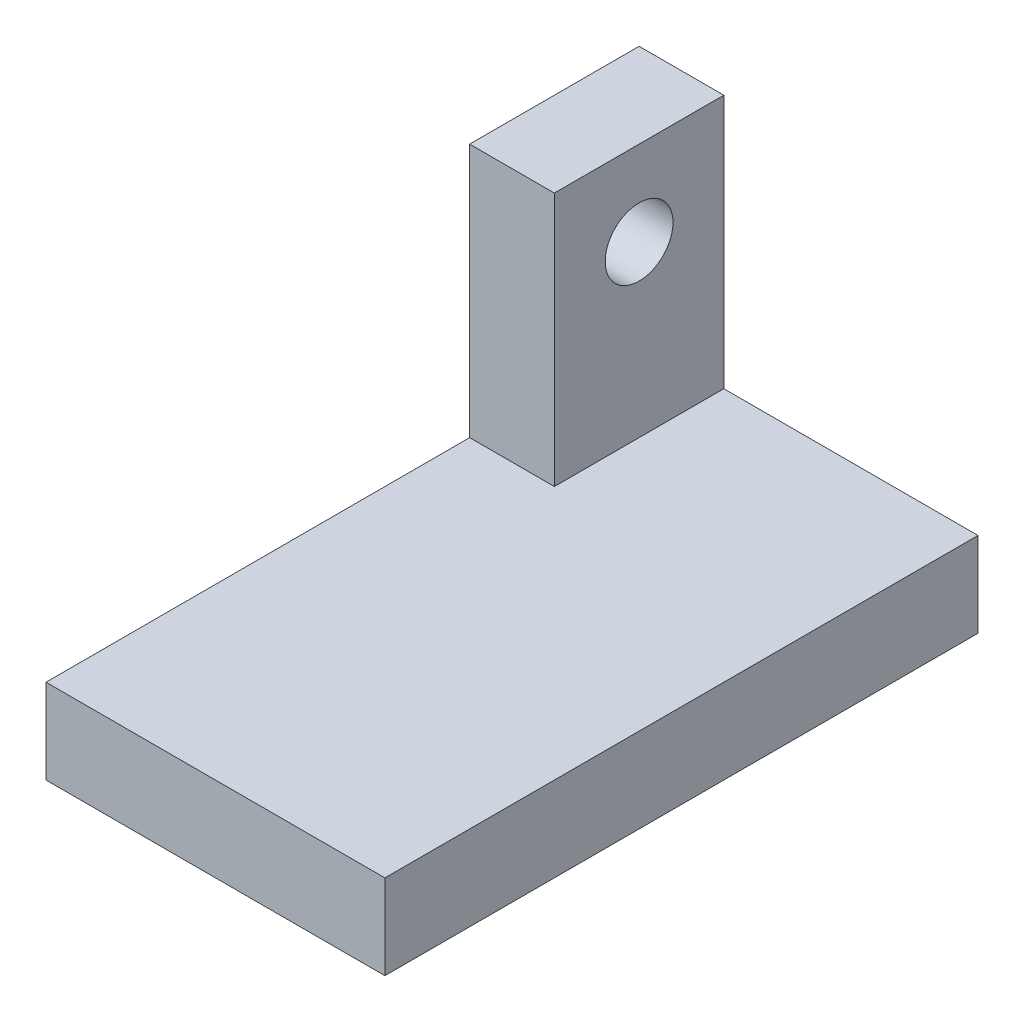
ISO-10303-21;
HEADER;
FILE_DESCRIPTION(('STEP AP214'),'2;1');
FILE_NAME('part.step','',(''),(''),'','','');
FILE_SCHEMA(('AUTOMOTIVE_DESIGN { 1 0 10303 214 1 1 1 1 }'));
ENDSEC;
DATA;
#1=APPLICATION_CONTEXT('core data for automotive mechanical design processes');
#2=APPLICATION_PROTOCOL_DEFINITION('international standard','automotive_design',2000,#1);
#3=PRODUCT_CONTEXT('',#1,'mechanical');
#4=PRODUCT('Part','Part','',(#3));
#5=PRODUCT_RELATED_PRODUCT_CATEGORY('part','',(#4));
#6=PRODUCT_DEFINITION_FORMATION('','',#4);
#7=PRODUCT_DEFINITION_CONTEXT('part definition',#1,'design');
#8=PRODUCT_DEFINITION('design','',#6,#7);
#9=PRODUCT_DEFINITION_SHAPE('','',#8);
#10=(LENGTH_UNIT() NAMED_UNIT(*) SI_UNIT(.MILLI.,.METRE.));
#11=(NAMED_UNIT(*) PLANE_ANGLE_UNIT() SI_UNIT($,.RADIAN.));
#12=(NAMED_UNIT(*) SI_UNIT($,.STERADIAN.) SOLID_ANGLE_UNIT());
#13=UNCERTAINTY_MEASURE_WITH_UNIT(LENGTH_MEASURE(1.E-05),#10,'distance_accuracy_value','');
#14=(GEOMETRIC_REPRESENTATION_CONTEXT(3) GLOBAL_UNCERTAINTY_ASSIGNED_CONTEXT((#13)) GLOBAL_UNIT_ASSIGNED_CONTEXT((#10,
#11,#12)) REPRESENTATION_CONTEXT('',''));
#15=CARTESIAN_POINT('',(0.,0.,0.));
#16=DIRECTION('',(0.,0.,1.));
#17=DIRECTION('',(1.,0.,0.));
#18=AXIS2_PLACEMENT_3D('',#15,#16,#17);
#19=CARTESIAN_POINT('',(20.,0.,0.));
#20=DIRECTION('',(0.,1.,0.));
#21=DIRECTION('',(0.,0.,1.));
#22=AXIS2_PLACEMENT_3D('',#19,#20,#21);
#23=PLANE('',#22);
#24=DIRECTION('',(-1.,0.,0.));
#25=VECTOR('',#24,1.);
#26=CARTESIAN_POINT('',(0.,0.,-25.));
#27=LINE('',#26,#25);
#28=CARTESIAN_POINT('',(5.,0.,-25.));
#29=VERTEX_POINT('',#28);
#30=CARTESIAN_POINT('',(0.,0.,-25.));
#31=VERTEX_POINT('',#30);
#32=EDGE_CURVE('E136',#29,#31,#27,.T.);
#33=ORIENTED_EDGE('',*,*,#32,.F.);
#34=DIRECTION('',(0.,0.,1.));
#35=VECTOR('',#34,1.);
#36=CARTESIAN_POINT('',(5.,0.,-35.));
#37=LINE('',#36,#35);
#38=CARTESIAN_POINT('',(5.,0.,-35.));
#39=VERTEX_POINT('',#38);
#40=EDGE_CURVE('E47',#39,#29,#37,.T.);
#41=ORIENTED_EDGE('',*,*,#40,.F.);
#42=DIRECTION('',(-1.,0.,0.));
#43=VECTOR('',#42,1.);
#44=CARTESIAN_POINT('',(20.,0.,-35.));
#45=LINE('',#44,#43);
#46=CARTESIAN_POINT('',(20.,0.,-35.));
#47=VERTEX_POINT('',#46);
#48=EDGE_CURVE('E40',#47,#39,#45,.T.);
#49=ORIENTED_EDGE('',*,*,#48,.F.);
#50=DIRECTION('',(0.,0.,-1.));
#51=VECTOR('',#50,1.);
#52=CARTESIAN_POINT('',(20.,0.,0.));
#53=LINE('',#52,#51);
#54=CARTESIAN_POINT('',(20.,0.,0.));
#55=VERTEX_POINT('',#54);
#56=EDGE_CURVE('E178',#55,#47,#53,.T.);
#57=ORIENTED_EDGE('',*,*,#56,.F.);
#58=DIRECTION('',(-1.,0.,0.));
#59=VECTOR('',#58,1.);
#60=CARTESIAN_POINT('',(20.,0.,0.));
#61=LINE('',#60,#59);
#62=CARTESIAN_POINT('',(0.,0.,0.));
#63=VERTEX_POINT('',#62);
#64=EDGE_CURVE('E11',#55,#63,#61,.T.);
#65=ORIENTED_EDGE('',*,*,#64,.T.);
#66=DIRECTION('',(0.,0.,-1.));
#67=VECTOR('',#66,1.);
#68=CARTESIAN_POINT('',(0.,0.,0.));
#69=LINE('',#68,#67);
#70=EDGE_CURVE('E52',#63,#31,#69,.T.);
#71=ORIENTED_EDGE('',*,*,#70,.T.);
#72=EDGE_LOOP('',(#33,#41,#49,#57,#65,#71));
#73=FACE_BOUND('',#72,.T.);
#74=ADVANCED_FACE('F32',(#73),#23,.F.);
#75=CARTESIAN_POINT('',(20.,5.,0.));
#76=DIRECTION('',(0.,-1.,0.));
#77=DIRECTION('',(0.,0.,-1.));
#78=AXIS2_PLACEMENT_3D('',#75,#76,#77);
#79=PLANE('',#78);
#80=DIRECTION('',(0.,0.,-1.));
#81=VECTOR('',#80,1.);
#82=CARTESIAN_POINT('',(5.,5.,-35.));
#83=LINE('',#82,#81);
#84=CARTESIAN_POINT('',(5.,5.,-25.));
#85=VERTEX_POINT('',#84);
#86=CARTESIAN_POINT('',(5.,5.,-35.));
#87=VERTEX_POINT('',#86);
#88=EDGE_CURVE('E155',#85,#87,#83,.T.);
#89=ORIENTED_EDGE('',*,*,#88,.F.);
#90=DIRECTION('',(1.,0.,0.));
#91=VECTOR('',#90,1.);
#92=CARTESIAN_POINT('',(0.,5.,-25.));
#93=LINE('',#92,#91);
#94=CARTESIAN_POINT('',(0.,5.,-25.));
#95=VERTEX_POINT('',#94);
#96=EDGE_CURVE('E152',#95,#85,#93,.T.);
#97=ORIENTED_EDGE('',*,*,#96,.F.);
#98=DIRECTION('',(0.,0.,1.));
#99=VECTOR('',#98,1.);
#100=CARTESIAN_POINT('',(0.,5.,0.));
#101=LINE('',#100,#99);
#102=CARTESIAN_POINT('',(0.,5.,0.));
#103=VERTEX_POINT('',#102);
#104=EDGE_CURVE('E121',#95,#103,#101,.T.);
#105=ORIENTED_EDGE('',*,*,#104,.T.);
#106=DIRECTION('',(-1.,0.,0.));
#107=VECTOR('',#106,1.);
#108=CARTESIAN_POINT('',(20.,5.,0.));
#109=LINE('',#108,#107);
#110=CARTESIAN_POINT('',(20.,5.,0.));
#111=VERTEX_POINT('',#110);
#112=EDGE_CURVE('E184',#111,#103,#109,.T.);
#113=ORIENTED_EDGE('',*,*,#112,.F.);
#114=DIRECTION('',(0.,0.,1.));
#115=VECTOR('',#114,1.);
#116=CARTESIAN_POINT('',(20.,5.,0.));
#117=LINE('',#116,#115);
#118=CARTESIAN_POINT('',(20.,5.,-35.));
#119=VERTEX_POINT('',#118);
#120=EDGE_CURVE('E182',#119,#111,#117,.T.);
#121=ORIENTED_EDGE('',*,*,#120,.F.);
#122=DIRECTION('',(-1.,0.,0.));
#123=VECTOR('',#122,1.);
#124=CARTESIAN_POINT('',(20.,5.,-35.));
#125=LINE('',#124,#123);
#126=EDGE_CURVE('E191',#119,#87,#125,.T.);
#127=ORIENTED_EDGE('',*,*,#126,.T.);
#128=EDGE_LOOP('',(#89,#97,#105,#113,#121,#127));
#129=FACE_BOUND('',#128,.T.);
#130=ADVANCED_FACE('F206',(#129),#79,.F.);
#131=CARTESIAN_POINT('',(20.,0.,0.));
#132=DIRECTION('',(0.,0.,-1.));
#133=DIRECTION('',(-1.,0.,0.));
#134=AXIS2_PLACEMENT_3D('',#131,#132,#133);
#135=PLANE('',#134);
#136=DIRECTION('',(0.,-1.,0.));
#137=VECTOR('',#136,1.);
#138=CARTESIAN_POINT('',(0.,0.,0.));
#139=LINE('',#138,#137);
#140=EDGE_CURVE('E174',#103,#63,#139,.T.);
#141=ORIENTED_EDGE('',*,*,#140,.T.);
#142=ORIENTED_EDGE('',*,*,#64,.F.);
#143=DIRECTION('',(0.,-1.,0.));
#144=VECTOR('',#143,1.);
#145=CARTESIAN_POINT('',(20.,0.,0.));
#146=LINE('',#145,#144);
#147=EDGE_CURVE('E175',#111,#55,#146,.T.);
#148=ORIENTED_EDGE('',*,*,#147,.F.);
#149=ORIENTED_EDGE('',*,*,#112,.T.);
#150=EDGE_LOOP('',(#141,#142,#148,#149));
#151=FACE_BOUND('',#150,.T.);
#152=ADVANCED_FACE('F34',(#151),#135,.F.);
#153=CARTESIAN_POINT('',(20.,0.,-35.));
#154=DIRECTION('',(0.,0.,1.));
#155=DIRECTION('',(1.,0.,0.));
#156=AXIS2_PLACEMENT_3D('',#153,#154,#155);
#157=PLANE('',#156);
#158=DIRECTION('',(0.,1.,0.));
#159=VECTOR('',#158,1.);
#160=CARTESIAN_POINT('',(0.,0.,-35.));
#161=LINE('',#160,#159);
#162=CARTESIAN_POINT('',(0.,-15.,-35.));
#163=VERTEX_POINT('',#162);
#164=CARTESIAN_POINT('',(0.,20.,-35.));
#165=VERTEX_POINT('',#164);
#166=EDGE_CURVE('E108',#163,#165,#161,.T.);
#167=ORIENTED_EDGE('',*,*,#166,.T.);
#168=DIRECTION('',(-1.,0.,0.));
#169=VECTOR('',#168,1.);
#170=CARTESIAN_POINT('',(0.,20.,-35.));
#171=LINE('',#170,#169);
#172=CARTESIAN_POINT('',(5.,20.,-35.));
#173=VERTEX_POINT('',#172);
#174=EDGE_CURVE('E159',#173,#165,#171,.T.);
#175=ORIENTED_EDGE('',*,*,#174,.F.);
#176=DIRECTION('',(0.,-1.,0.));
#177=VECTOR('',#176,1.);
#178=CARTESIAN_POINT('',(5.,20.,-35.));
#179=LINE('',#178,#177);
#180=EDGE_CURVE('E161',#173,#87,#179,.T.);
#181=ORIENTED_EDGE('',*,*,#180,.T.);
#182=ORIENTED_EDGE('',*,*,#126,.F.);
#183=DIRECTION('',(0.,1.,0.));
#184=VECTOR('',#183,1.);
#185=CARTESIAN_POINT('',(20.,0.,-35.));
#186=LINE('',#185,#184);
#187=EDGE_CURVE('E180',#47,#119,#186,.T.);
#188=ORIENTED_EDGE('',*,*,#187,.F.);
#189=ORIENTED_EDGE('',*,*,#48,.T.);
#190=DIRECTION('',(0.,1.,0.));
#191=VECTOR('',#190,1.);
#192=CARTESIAN_POINT('',(5.,-15.,-35.));
#193=LINE('',#192,#191);
#194=CARTESIAN_POINT('',(5.,-15.,-35.));
#195=VERTEX_POINT('',#194);
#196=EDGE_CURVE('E127',#195,#39,#193,.T.);
#197=ORIENTED_EDGE('',*,*,#196,.F.);
#198=DIRECTION('',(1.,0.,0.));
#199=VECTOR('',#198,1.);
#200=CARTESIAN_POINT('',(0.,-15.,-35.));
#201=LINE('',#200,#199);
#202=EDGE_CURVE('E124',#163,#195,#201,.T.);
#203=ORIENTED_EDGE('',*,*,#202,.F.);
#204=EDGE_LOOP('',(#167,#175,#181,#182,#188,#189,#197,#203));
#205=FACE_BOUND('',#204,.T.);
#206=ADVANCED_FACE('F125',(#205),#157,.F.);
#207=CARTESIAN_POINT('',(20.,0.,0.));
#208=DIRECTION('',(-1.,0.,0.));
#209=DIRECTION('',(0.,0.,1.));
#210=AXIS2_PLACEMENT_3D('',#207,#208,#209);
#211=PLANE('',#210);
#212=ORIENTED_EDGE('',*,*,#147,.T.);
#213=ORIENTED_EDGE('',*,*,#56,.T.);
#214=ORIENTED_EDGE('',*,*,#187,.T.);
#215=ORIENTED_EDGE('',*,*,#120,.T.);
#216=EDGE_LOOP('',(#212,#213,#214,#215));
#217=FACE_BOUND('',#216,.T.);
#218=ADVANCED_FACE('F233',(#217),#211,.F.);
#219=CARTESIAN_POINT('',(0.,0.,0.));
#220=DIRECTION('',(-1.,0.,0.));
#221=DIRECTION('',(0.,0.,1.));
#222=AXIS2_PLACEMENT_3D('',#219,#220,#221);
#223=PLANE('',#222);
#224=CARTESIAN_POINT('',(0.,-10.,-30.));
#225=DIRECTION('',(-1.,0.,0.));
#226=DIRECTION('',(0.,0.,1.));
#227=AXIS2_PLACEMENT_3D('',#224,#225,#226);
#228=CIRCLE('',#227,2.);
#229=CARTESIAN_POINT('',(0.,-10.,-28.));
#230=VERTEX_POINT('',#229);
#231=EDGE_CURVE('E325',#230,#230,#228,.T.);
#232=ORIENTED_EDGE('',*,*,#231,.F.);
#233=EDGE_LOOP('',(#232));
#234=FACE_BOUND('',#233,.T.);
#235=CARTESIAN_POINT('',(0.,15.,-30.));
#236=DIRECTION('',(-1.,0.,0.));
#237=DIRECTION('',(0.,0.,1.));
#238=AXIS2_PLACEMENT_3D('',#235,#236,#237);
#239=CIRCLE('',#238,2.);
#240=CARTESIAN_POINT('',(0.,15.,-28.));
#241=VERTEX_POINT('',#240);
#242=EDGE_CURVE('E140',#241,#241,#239,.T.);
#243=ORIENTED_EDGE('',*,*,#242,.F.);
#244=EDGE_LOOP('',(#243));
#245=FACE_BOUND('',#244,.T.);
#246=ORIENTED_EDGE('',*,*,#140,.F.);
#247=ORIENTED_EDGE('',*,*,#104,.F.);
#248=DIRECTION('',(0.,-1.,0.));
#249=VECTOR('',#248,1.);
#250=CARTESIAN_POINT('',(0.,20.,-25.));
#251=LINE('',#250,#249);
#252=CARTESIAN_POINT('',(0.,20.,-25.));
#253=VERTEX_POINT('',#252);
#254=EDGE_CURVE('E171',#253,#95,#251,.T.);
#255=ORIENTED_EDGE('',*,*,#254,.F.);
#256=DIRECTION('',(0.,0.,1.));
#257=VECTOR('',#256,1.);
#258=CARTESIAN_POINT('',(0.,20.,-35.));
#259=LINE('',#258,#257);
#260=EDGE_CURVE('E117',#165,#253,#259,.T.);
#261=ORIENTED_EDGE('',*,*,#260,.F.);
#262=ORIENTED_EDGE('',*,*,#166,.F.);
#263=DIRECTION('',(0.,0.,-1.));
#264=VECTOR('',#263,1.);
#265=CARTESIAN_POINT('',(0.,-15.,-35.));
#266=LINE('',#265,#264);
#267=CARTESIAN_POINT('',(0.,-15.,-25.));
#268=VERTEX_POINT('',#267);
#269=EDGE_CURVE('E114',#268,#163,#266,.T.);
#270=ORIENTED_EDGE('',*,*,#269,.F.);
#271=DIRECTION('',(0.,1.,0.));
#272=VECTOR('',#271,1.);
#273=CARTESIAN_POINT('',(0.,-15.,-25.));
#274=LINE('',#273,#272);
#275=EDGE_CURVE('E145',#268,#31,#274,.T.);
#276=ORIENTED_EDGE('',*,*,#275,.T.);
#277=ORIENTED_EDGE('',*,*,#70,.F.);
#278=EDGE_LOOP('',(#246,#247,#255,#261,#262,#270,#276,#277));
#279=FACE_BOUND('',#278,.T.);
#280=ADVANCED_FACE('F111',(#234,#245,#279),#223,.T.);
#281=CARTESIAN_POINT('',(0.,20.,-25.));
#282=DIRECTION('',(0.,0.,-1.));
#283=DIRECTION('',(0.,1.,0.));
#284=AXIS2_PLACEMENT_3D('',#281,#282,#283);
#285=PLANE('',#284);
#286=ORIENTED_EDGE('',*,*,#96,.T.);
#287=DIRECTION('',(0.,-1.,0.));
#288=VECTOR('',#287,1.);
#289=CARTESIAN_POINT('',(5.,20.,-25.));
#290=LINE('',#289,#288);
#291=CARTESIAN_POINT('',(5.,20.,-25.));
#292=VERTEX_POINT('',#291);
#293=EDGE_CURVE('E168',#292,#85,#290,.T.);
#294=ORIENTED_EDGE('',*,*,#293,.F.);
#295=DIRECTION('',(1.,0.,0.));
#296=VECTOR('',#295,1.);
#297=CARTESIAN_POINT('',(0.,20.,-25.));
#298=LINE('',#297,#296);
#299=EDGE_CURVE('E154',#253,#292,#298,.T.);
#300=ORIENTED_EDGE('',*,*,#299,.F.);
#301=ORIENTED_EDGE('',*,*,#254,.T.);
#302=EDGE_LOOP('',(#286,#294,#300,#301));
#303=FACE_BOUND('',#302,.T.);
#304=ADVANCED_FACE('F208',(#303),#285,.F.);
#305=CARTESIAN_POINT('',(5.,20.,-35.));
#306=DIRECTION('',(-1.,0.,0.));
#307=DIRECTION('',(0.,0.,1.));
#308=AXIS2_PLACEMENT_3D('',#305,#306,#307);
#309=PLANE('',#308);
#310=CARTESIAN_POINT('',(5.,15.,-30.));
#311=DIRECTION('',(1.,0.,0.));
#312=DIRECTION('',(0.,0.,-1.));
#313=AXIS2_PLACEMENT_3D('',#310,#311,#312);
#314=CIRCLE('',#313,2.);
#315=CARTESIAN_POINT('',(5.,15.,-32.));
#316=VERTEX_POINT('',#315);
#317=EDGE_CURVE('E327',#316,#316,#314,.T.);
#318=ORIENTED_EDGE('',*,*,#317,.F.);
#319=EDGE_LOOP('',(#318));
#320=FACE_BOUND('',#319,.T.);
#321=ORIENTED_EDGE('',*,*,#88,.T.);
#322=ORIENTED_EDGE('',*,*,#180,.F.);
#323=DIRECTION('',(0.,0.,-1.));
#324=VECTOR('',#323,1.);
#325=CARTESIAN_POINT('',(5.,20.,-35.));
#326=LINE('',#325,#324);
#327=EDGE_CURVE('E157',#292,#173,#326,.T.);
#328=ORIENTED_EDGE('',*,*,#327,.F.);
#329=ORIENTED_EDGE('',*,*,#293,.T.);
#330=EDGE_LOOP('',(#321,#322,#328,#329));
#331=FACE_BOUND('',#330,.T.);
#332=ADVANCED_FACE('F215',(#320,#331),#309,.F.);
#333=CARTESIAN_POINT('',(0.,20.,0.));
#334=DIRECTION('',(0.,1.,0.));
#335=DIRECTION('',(0.,0.,1.));
#336=AXIS2_PLACEMENT_3D('',#333,#334,#335);
#337=PLANE('',#336);
#338=ORIENTED_EDGE('',*,*,#260,.T.);
#339=ORIENTED_EDGE('',*,*,#299,.T.);
#340=ORIENTED_EDGE('',*,*,#327,.T.);
#341=ORIENTED_EDGE('',*,*,#174,.T.);
#342=EDGE_LOOP('',(#338,#339,#340,#341));
#343=FACE_BOUND('',#342,.T.);
#344=ADVANCED_FACE('F212',(#343),#337,.T.);
#345=CARTESIAN_POINT('',(5.,-15.,-35.));
#346=DIRECTION('',(-1.,0.,0.));
#347=DIRECTION('',(0.,0.,1.));
#348=AXIS2_PLACEMENT_3D('',#345,#346,#347);
#349=PLANE('',#348);
#350=CARTESIAN_POINT('',(5.,-10.,-30.));
#351=DIRECTION('',(1.,0.,0.));
#352=DIRECTION('',(0.,0.,-1.));
#353=AXIS2_PLACEMENT_3D('',#350,#351,#352);
#354=CIRCLE('',#353,2.);
#355=CARTESIAN_POINT('',(5.,-10.,-32.));
#356=VERTEX_POINT('',#355);
#357=EDGE_CURVE('E324',#356,#356,#354,.T.);
#358=ORIENTED_EDGE('',*,*,#357,.F.);
#359=EDGE_LOOP('',(#358));
#360=FACE_BOUND('',#359,.T.);
#361=ORIENTED_EDGE('',*,*,#40,.T.);
#362=DIRECTION('',(0.,1.,0.));
#363=VECTOR('',#362,1.);
#364=CARTESIAN_POINT('',(5.,-15.,-25.));
#365=LINE('',#364,#363);
#366=CARTESIAN_POINT('',(5.,-15.,-25.));
#367=VERTEX_POINT('',#366);
#368=EDGE_CURVE('E148',#367,#29,#365,.T.);
#369=ORIENTED_EDGE('',*,*,#368,.F.);
#370=DIRECTION('',(0.,0.,1.));
#371=VECTOR('',#370,1.);
#372=CARTESIAN_POINT('',(5.,-15.,-35.));
#373=LINE('',#372,#371);
#374=EDGE_CURVE('E130',#195,#367,#373,.T.);
#375=ORIENTED_EDGE('',*,*,#374,.F.);
#376=ORIENTED_EDGE('',*,*,#196,.T.);
#377=EDGE_LOOP('',(#361,#369,#375,#376));
#378=FACE_BOUND('',#377,.T.);
#379=ADVANCED_FACE('F195',(#360,#378),#349,.F.);
#380=CARTESIAN_POINT('',(0.,-15.,-25.));
#381=DIRECTION('',(0.,0.,-1.));
#382=DIRECTION('',(-1.,0.,0.));
#383=AXIS2_PLACEMENT_3D('',#380,#381,#382);
#384=PLANE('',#383);
#385=ORIENTED_EDGE('',*,*,#32,.T.);
#386=ORIENTED_EDGE('',*,*,#275,.F.);
#387=DIRECTION('',(-1.,0.,0.));
#388=VECTOR('',#387,1.);
#389=CARTESIAN_POINT('',(0.,-15.,-25.));
#390=LINE('',#389,#388);
#391=EDGE_CURVE('E134',#367,#268,#390,.T.);
#392=ORIENTED_EDGE('',*,*,#391,.F.);
#393=ORIENTED_EDGE('',*,*,#368,.T.);
#394=EDGE_LOOP('',(#385,#386,#392,#393));
#395=FACE_BOUND('',#394,.T.);
#396=ADVANCED_FACE('F198',(#395),#384,.F.);
#397=CARTESIAN_POINT('',(0.,-15.,0.));
#398=DIRECTION('',(0.,1.,0.));
#399=DIRECTION('',(0.,0.,1.));
#400=AXIS2_PLACEMENT_3D('',#397,#398,#399);
#401=PLANE('',#400);
#402=ORIENTED_EDGE('',*,*,#269,.T.);
#403=ORIENTED_EDGE('',*,*,#202,.T.);
#404=ORIENTED_EDGE('',*,*,#374,.T.);
#405=ORIENTED_EDGE('',*,*,#391,.T.);
#406=EDGE_LOOP('',(#402,#403,#404,#405));
#407=FACE_BOUND('',#406,.T.);
#408=ADVANCED_FACE('F132',(#407),#401,.F.);
#409=CARTESIAN_POINT('',(-10.,15.,-30.));
#410=DIRECTION('',(1.,0.,0.));
#411=DIRECTION('',(0.,0.,-1.));
#412=AXIS2_PLACEMENT_3D('',#409,#410,#411);
#413=CYLINDRICAL_SURFACE('',#412,2.);
#414=ORIENTED_EDGE('',*,*,#242,.T.);
#415=EDGE_LOOP('',(#414));
#416=FACE_BOUND('',#415,.T.);
#417=ORIENTED_EDGE('',*,*,#317,.T.);
#418=EDGE_LOOP('',(#417));
#419=FACE_BOUND('',#418,.T.);
#420=ADVANCED_FACE('F292',(#416,#419),#413,.F.);
#421=CARTESIAN_POINT('',(-10.,-10.,-30.));
#422=DIRECTION('',(1.,0.,0.));
#423=DIRECTION('',(0.,0.,-1.));
#424=AXIS2_PLACEMENT_3D('',#421,#422,#423);
#425=CYLINDRICAL_SURFACE('',#424,2.);
#426=ORIENTED_EDGE('',*,*,#231,.T.);
#427=EDGE_LOOP('',(#426));
#428=FACE_BOUND('',#427,.T.);
#429=ORIENTED_EDGE('',*,*,#357,.T.);
#430=EDGE_LOOP('',(#429));
#431=FACE_BOUND('',#430,.T.);
#432=ADVANCED_FACE('F302',(#428,#431),#425,.F.);
#433=CLOSED_SHELL('',(#74,#130,#152,#206,#218,#280,#304,#332,#344,#379,#396,#408,#420,#432));
#434=MANIFOLD_SOLID_BREP('B2',#433);
#435=ADVANCED_BREP_SHAPE_REPRESENTATION('',(#18,#434),#14);
#436=SHAPE_DEFINITION_REPRESENTATION(#9,#435);
ENDSEC;
END-ISO-10303-21;
